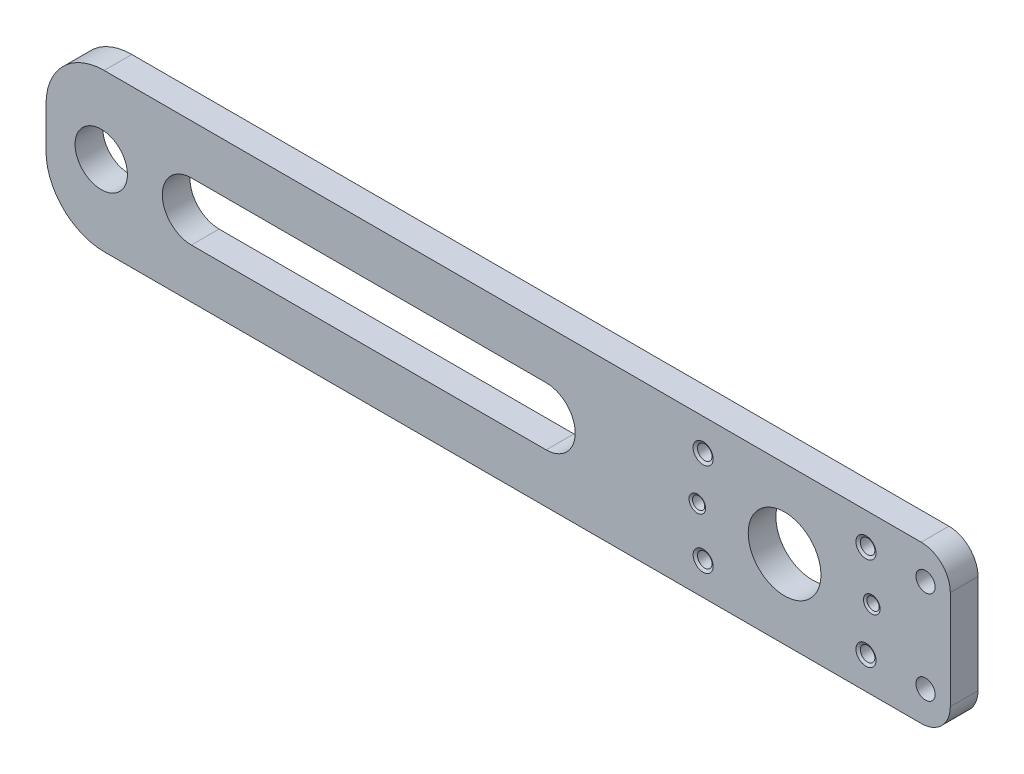
ISO-10303-21;
HEADER;
FILE_DESCRIPTION(('STEP AP214'),'2;1');
FILE_NAME('part.step','',(''),(''),'','','');
FILE_SCHEMA(('AUTOMOTIVE_DESIGN { 1 0 10303 214 1 1 1 1 }'));
ENDSEC;
DATA;
#1=APPLICATION_CONTEXT('core data for automotive mechanical design processes');
#2=APPLICATION_PROTOCOL_DEFINITION('international standard','automotive_design',2000,#1);
#3=PRODUCT_CONTEXT('',#1,'mechanical');
#4=PRODUCT('Part','Part','',(#3));
#5=PRODUCT_RELATED_PRODUCT_CATEGORY('part','',(#4));
#6=PRODUCT_DEFINITION_FORMATION('','',#4);
#7=PRODUCT_DEFINITION_CONTEXT('part definition',#1,'design');
#8=PRODUCT_DEFINITION('design','',#6,#7);
#9=PRODUCT_DEFINITION_SHAPE('','',#8);
#10=(LENGTH_UNIT() NAMED_UNIT(*) SI_UNIT(.MILLI.,.METRE.));
#11=(NAMED_UNIT(*) PLANE_ANGLE_UNIT() SI_UNIT($,.RADIAN.));
#12=(NAMED_UNIT(*) SI_UNIT($,.STERADIAN.) SOLID_ANGLE_UNIT());
#13=UNCERTAINTY_MEASURE_WITH_UNIT(LENGTH_MEASURE(1.E-05),#10,'distance_accuracy_value','');
#14=(GEOMETRIC_REPRESENTATION_CONTEXT(3) GLOBAL_UNCERTAINTY_ASSIGNED_CONTEXT((#13)) GLOBAL_UNIT_ASSIGNED_CONTEXT((#10,
#11,#12)) REPRESENTATION_CONTEXT('',''));
#15=CARTESIAN_POINT('',(0.,0.,0.));
#16=DIRECTION('',(0.,0.,1.));
#17=DIRECTION('',(1.,0.,0.));
#18=AXIS2_PLACEMENT_3D('',#15,#16,#17);
#19=CARTESIAN_POINT('',(504.510652388512,-385.151572168843,-676.825000000008));
#20=DIRECTION('',(0.,0.,1.));
#21=DIRECTION('',(1.,0.,0.));
#22=AXIS2_PLACEMENT_3D('',#19,#20,#21);
#23=CONICAL_SURFACE('',#22,3.45000000000895,1.0471975512156);
#24=CARTESIAN_POINT('',(504.510652388512,-385.151572168843,-676.825000000021));
#25=DIRECTION('',(0.,0.,1.));
#26=DIRECTION('',(1.,0.,0.));
#27=AXIS2_PLACEMENT_3D('',#24,#25,#26);
#28=CIRCLE('',#27,3.44999999998663);
#29=CARTESIAN_POINT('',(507.960652388499,-385.151572168843,-676.825000000021));
#30=VERTEX_POINT('',#29);
#31=EDGE_CURVE('E249',#30,#30,#28,.T.);
#32=ORIENTED_EDGE('',*,*,#31,.T.);
#33=EDGE_LOOP('',(#32));
#34=FACE_BOUND('',#33,.T.);
#35=CARTESIAN_POINT('',(504.510652388512,-385.151572168843,-677.37348275573));
#36=DIRECTION('',(0.,0.,1.));
#37=DIRECTION('',(1.,0.,0.));
#38=AXIS2_PLACEMENT_3D('',#35,#36,#37);
#39=CIRCLE('',#38,2.5);
#40=CARTESIAN_POINT('',(507.010652388512,-385.151572168843,-677.37348275573));
#41=VERTEX_POINT('',#40);
#42=EDGE_CURVE('E167',#41,#41,#39,.F.);
#43=ORIENTED_EDGE('',*,*,#42,.T.);
#44=EDGE_LOOP('',(#43));
#45=FACE_BOUND('',#44,.T.);
#46=ADVANCED_FACE('F17',(#34,#45),#23,.F.);
#47=CARTESIAN_POINT('',(504.510652388512,-417.151572168843,-676.825000000008));
#48=DIRECTION('',(0.,0.,1.));
#49=DIRECTION('',(1.,0.,0.));
#50=AXIS2_PLACEMENT_3D('',#47,#48,#49);
#51=CONICAL_SURFACE('',#50,3.45000000000895,1.0471975512156);
#52=CARTESIAN_POINT('',(504.510652388512,-417.151572168843,-676.825000000021));
#53=DIRECTION('',(0.,0.,1.));
#54=DIRECTION('',(1.,0.,0.));
#55=AXIS2_PLACEMENT_3D('',#52,#53,#54);
#56=CIRCLE('',#55,3.44999999998663);
#57=CARTESIAN_POINT('',(507.960652388499,-417.151572168843,-676.825000000021));
#58=VERTEX_POINT('',#57);
#59=EDGE_CURVE('E244',#58,#58,#56,.T.);
#60=ORIENTED_EDGE('',*,*,#59,.T.);
#61=EDGE_LOOP('',(#60));
#62=FACE_BOUND('',#61,.T.);
#63=CARTESIAN_POINT('',(504.510652388512,-417.151572168843,-677.37348275573));
#64=DIRECTION('',(0.,0.,1.));
#65=DIRECTION('',(1.,0.,0.));
#66=AXIS2_PLACEMENT_3D('',#63,#64,#65);
#67=CIRCLE('',#66,2.5);
#68=CARTESIAN_POINT('',(507.010652388512,-417.151572168843,-677.37348275573));
#69=VERTEX_POINT('',#68);
#70=EDGE_CURVE('E114',#69,#69,#67,.F.);
#71=ORIENTED_EDGE('',*,*,#70,.T.);
#72=EDGE_LOOP('',(#71));
#73=FACE_BOUND('',#72,.T.);
#74=ADVANCED_FACE('F559',(#62,#73),#51,.F.);
#75=CARTESIAN_POINT('',(446.510652388512,-401.151572168843,-676.825000000065));
#76=DIRECTION('',(0.,0.,1.));
#77=DIRECTION('',(1.,0.,0.));
#78=AXIS2_PLACEMENT_3D('',#75,#76,#77);
#79=CONICAL_SURFACE('',#78,2.86000000001341,1.04719755119142);
#80=CARTESIAN_POINT('',(446.510652388512,-401.151572168843,-676.825000000074));
#81=DIRECTION('',(0.,0.,1.));
#82=DIRECTION('',(1.,0.,0.));
#83=AXIS2_PLACEMENT_3D('',#80,#81,#82);
#84=CIRCLE('',#83,2.85999999999831);
#85=CARTESIAN_POINT('',(449.37065238851,-401.151572168843,-676.825000000074));
#86=VERTEX_POINT('',#85);
#87=EDGE_CURVE('E241',#86,#86,#84,.T.);
#88=ORIENTED_EDGE('',*,*,#87,.T.);
#89=EDGE_LOOP('',(#88));
#90=FACE_BOUND('',#89,.T.);
#91=CARTESIAN_POINT('',(446.510652388512,-401.151572168843,-677.263786204584));
#92=DIRECTION('',(0.,0.,1.));
#93=DIRECTION('',(1.,0.,0.));
#94=AXIS2_PLACEMENT_3D('',#91,#92,#93);
#95=CIRCLE('',#94,2.1);
#96=CARTESIAN_POINT('',(448.610652388512,-401.151572168843,-677.263786204584));
#97=VERTEX_POINT('',#96);
#98=EDGE_CURVE('E159',#97,#97,#95,.F.);
#99=ORIENTED_EDGE('',*,*,#98,.T.);
#100=EDGE_LOOP('',(#99));
#101=FACE_BOUND('',#100,.T.);
#102=ADVANCED_FACE('F551',(#90,#101),#79,.F.);
#103=CARTESIAN_POINT('',(448.510652388512,-417.151572168843,-676.825000000065));
#104=DIRECTION('',(0.,0.,1.));
#105=DIRECTION('',(1.,0.,0.));
#106=AXIS2_PLACEMENT_3D('',#103,#104,#105);
#107=CONICAL_SURFACE('',#106,3.44999999999213,1.04719755119663);
#108=CARTESIAN_POINT('',(448.510652388512,-417.151572168843,-676.825000000068));
#109=DIRECTION('',(0.,0.,1.));
#110=DIRECTION('',(1.,0.,0.));
#111=AXIS2_PLACEMENT_3D('',#108,#109,#110);
#112=CIRCLE('',#111,3.44999999998663);
#113=CARTESIAN_POINT('',(451.960652388499,-417.151572168843,-676.825000000068));
#114=VERTEX_POINT('',#113);
#115=EDGE_CURVE('E20',#114,#114,#112,.T.);
#116=ORIENTED_EDGE('',*,*,#115,.T.);
#117=EDGE_LOOP('',(#116));
#118=FACE_BOUND('',#117,.T.);
#119=CARTESIAN_POINT('',(448.510652388512,-417.151572168843,-677.37348275573));
#120=DIRECTION('',(0.,0.,1.));
#121=DIRECTION('',(1.,0.,0.));
#122=AXIS2_PLACEMENT_3D('',#119,#120,#121);
#123=CIRCLE('',#122,2.5);
#124=CARTESIAN_POINT('',(451.010652388512,-417.151572168843,-677.37348275573));
#125=VERTEX_POINT('',#124);
#126=EDGE_CURVE('E156',#125,#125,#123,.F.);
#127=ORIENTED_EDGE('',*,*,#126,.T.);
#128=EDGE_LOOP('',(#127));
#129=FACE_BOUND('',#128,.T.);
#130=ADVANCED_FACE('F256',(#118,#129),#107,.F.);
#131=CARTESIAN_POINT('',(448.510652388512,-385.151572168843,-676.825000000065));
#132=DIRECTION('',(0.,0.,1.));
#133=DIRECTION('',(1.,0.,0.));
#134=AXIS2_PLACEMENT_3D('',#131,#132,#133);
#135=CONICAL_SURFACE('',#134,3.44999999999213,1.04719755119663);
#136=CARTESIAN_POINT('',(448.510652388512,-385.151572168843,-676.825000000068));
#137=DIRECTION('',(0.,0.,1.));
#138=DIRECTION('',(1.,0.,0.));
#139=AXIS2_PLACEMENT_3D('',#136,#137,#138);
#140=CIRCLE('',#139,3.44999999998663);
#141=CARTESIAN_POINT('',(451.960652388499,-385.151572168843,-676.825000000068));
#142=VERTEX_POINT('',#141);
#143=EDGE_CURVE('E247',#142,#142,#140,.T.);
#144=ORIENTED_EDGE('',*,*,#143,.T.);
#145=EDGE_LOOP('',(#144));
#146=FACE_BOUND('',#145,.T.);
#147=CARTESIAN_POINT('',(448.510652388512,-385.151572168843,-677.37348275573));
#148=DIRECTION('',(0.,0.,1.));
#149=DIRECTION('',(1.,0.,0.));
#150=AXIS2_PLACEMENT_3D('',#147,#148,#149);
#151=CIRCLE('',#150,2.5);
#152=CARTESIAN_POINT('',(451.010652388512,-385.151572168843,-677.37348275573));
#153=VERTEX_POINT('',#152);
#154=EDGE_CURVE('E153',#153,#153,#151,.F.);
#155=ORIENTED_EDGE('',*,*,#154,.T.);
#156=EDGE_LOOP('',(#155));
#157=FACE_BOUND('',#156,.T.);
#158=ADVANCED_FACE('F534',(#146,#157),#135,.F.);
#159=CARTESIAN_POINT('',(506.510652388512,-401.151572168843,-676.825000000065));
#160=DIRECTION('',(0.,0.,1.));
#161=DIRECTION('',(1.,0.,0.));
#162=AXIS2_PLACEMENT_3D('',#159,#160,#161);
#163=CONICAL_SURFACE('',#162,2.86000000001108,1.04719755119142);
#164=CARTESIAN_POINT('',(506.510652388512,-401.151572168843,-676.825000000072));
#165=DIRECTION('',(0.,0.,1.));
#166=DIRECTION('',(1.,0.,0.));
#167=AXIS2_PLACEMENT_3D('',#164,#165,#166);
#168=CIRCLE('',#167,2.85999999999831);
#169=CARTESIAN_POINT('',(509.37065238851,-401.151572168843,-676.825000000072));
#170=VERTEX_POINT('',#169);
#171=EDGE_CURVE('E238',#170,#170,#168,.T.);
#172=ORIENTED_EDGE('',*,*,#171,.T.);
#173=EDGE_LOOP('',(#172));
#174=FACE_BOUND('',#173,.T.);
#175=CARTESIAN_POINT('',(506.510652388512,-401.151572168843,-677.263786204584));
#176=DIRECTION('',(0.,0.,1.));
#177=DIRECTION('',(1.,0.,0.));
#178=AXIS2_PLACEMENT_3D('',#175,#176,#177);
#179=CIRCLE('',#178,2.1);
#180=CARTESIAN_POINT('',(508.610652388512,-401.151572168843,-677.263786204584));
#181=VERTEX_POINT('',#180);
#182=EDGE_CURVE('E149',#181,#181,#179,.F.);
#183=ORIENTED_EDGE('',*,*,#182,.T.);
#184=EDGE_LOOP('',(#183));
#185=FACE_BOUND('',#184,.T.);
#186=ADVANCED_FACE('F262',(#174,#185),#163,.F.);
#187=CARTESIAN_POINT('',(476.510652388512,-354.095322168843,-676.825));
#188=DIRECTION('',(0.,0.,-1.));
#189=DIRECTION('',(-1.,0.,0.));
#190=AXIS2_PLACEMENT_3D('',#187,#188,#189);
#191=PLANE('',#190);
#192=CARTESIAN_POINT('',(523.510652388512,-418.151572168843,-676.825));
#193=DIRECTION('',(0.,0.,-1.));
#194=DIRECTION('',(-1.,0.,0.));
#195=AXIS2_PLACEMENT_3D('',#192,#193,#194);
#196=CIRCLE('',#195,10.);
#197=CARTESIAN_POINT('',(533.510652388512,-418.151572168843,-676.825));
#198=VERTEX_POINT('',#197);
#199=CARTESIAN_POINT('',(523.510652388512,-428.151572168843,-676.825));
#200=VERTEX_POINT('',#199);
#201=EDGE_CURVE('E222',#198,#200,#196,.T.);
#202=ORIENTED_EDGE('',*,*,#201,.F.);
#203=DIRECTION('',(0.,1.,0.));
#204=VECTOR('',#203,1.);
#205=CARTESIAN_POINT('',(533.510652388512,-431.151572168843,-676.825));
#206=LINE('',#205,#204);
#207=CARTESIAN_POINT('',(533.510652388512,-384.151572168843,-676.825));
#208=VERTEX_POINT('',#207);
#209=EDGE_CURVE('E141',#208,#198,#206,.F.);
#210=ORIENTED_EDGE('',*,*,#209,.F.);
#211=CARTESIAN_POINT('',(523.510652388512,-384.151572168843,-676.825));
#212=DIRECTION('',(0.,0.,-1.));
#213=DIRECTION('',(-1.,0.,0.));
#214=AXIS2_PLACEMENT_3D('',#211,#212,#213);
#215=CIRCLE('',#214,10.);
#216=CARTESIAN_POINT('',(523.510652388512,-374.151572168843,-676.825));
#217=VERTEX_POINT('',#216);
#218=EDGE_CURVE('E224',#217,#208,#215,.T.);
#219=ORIENTED_EDGE('',*,*,#218,.F.);
#220=DIRECTION('',(-1.,0.,0.));
#221=VECTOR('',#220,1.);
#222=CARTESIAN_POINT('',(503.956052731738,-374.151572168843,-676.825));
#223=LINE('',#222,#221);
#224=CARTESIAN_POINT('',(242.510652388512,-374.151572168843,-676.825));
#225=VERTEX_POINT('',#224);
#226=EDGE_CURVE('E145',#225,#217,#223,.F.);
#227=ORIENTED_EDGE('',*,*,#226,.F.);
#228=CARTESIAN_POINT('',(242.510652388512,-394.151572168843,-676.825));
#229=DIRECTION('',(0.,0.,1.));
#230=DIRECTION('',(1.,0.,0.));
#231=AXIS2_PLACEMENT_3D('',#228,#229,#230);
#232=CIRCLE('',#231,20.);
#233=CARTESIAN_POINT('',(222.510652388512,-394.151572168843,-676.825));
#234=VERTEX_POINT('',#233);
#235=EDGE_CURVE('E226',#234,#225,#232,.F.);
#236=ORIENTED_EDGE('',*,*,#235,.F.);
#237=DIRECTION('',(0.,1.,0.));
#238=VECTOR('',#237,1.);
#239=CARTESIAN_POINT('',(222.510652388512,-371.151572168843,-676.825));
#240=LINE('',#239,#238);
#241=CARTESIAN_POINT('',(222.510652388512,-408.151572168843,-676.825));
#242=VERTEX_POINT('',#241);
#243=EDGE_CURVE('E137',#234,#242,#240,.F.);
#244=ORIENTED_EDGE('',*,*,#243,.T.);
#245=CARTESIAN_POINT('',(242.510652388512,-408.151572168843,-676.825));
#246=DIRECTION('',(0.,0.,-1.));
#247=DIRECTION('',(-1.,0.,0.));
#248=AXIS2_PLACEMENT_3D('',#245,#246,#247);
#249=CIRCLE('',#248,20.);
#250=CARTESIAN_POINT('',(242.510652388512,-428.151572168843,-676.825));
#251=VERTEX_POINT('',#250);
#252=EDGE_CURVE('E219',#251,#242,#249,.T.);
#253=ORIENTED_EDGE('',*,*,#252,.F.);
#254=DIRECTION('',(1.,0.,0.));
#255=VECTOR('',#254,1.);
#256=CARTESIAN_POINT('',(449.065252045285,-428.151572168843,-676.825));
#257=LINE('',#256,#255);
#258=EDGE_CURVE('E133',#200,#251,#257,.F.);
#259=ORIENTED_EDGE('',*,*,#258,.F.);
#260=EDGE_LOOP('',(#202,#210,#219,#227,#236,#244,#253,#259));
#261=FACE_BOUND('',#260,.T.);
#262=CARTESIAN_POINT('',(524.985652388511,-417.151572168843,-676.825));
#263=DIRECTION('',(0.,0.,-1.));
#264=DIRECTION('',(-1.,0.,0.));
#265=AXIS2_PLACEMENT_3D('',#262,#263,#264);
#266=CIRCLE('',#265,3.3);
#267=CARTESIAN_POINT('',(521.685652388511,-417.151572168843,-676.825));
#268=VERTEX_POINT('',#267);
#269=EDGE_CURVE('E140',#268,#268,#266,.T.);
#270=ORIENTED_EDGE('',*,*,#269,.T.);
#271=EDGE_LOOP('',(#270));
#272=FACE_BOUND('',#271,.T.);
#273=ORIENTED_EDGE('',*,*,#171,.F.);
#274=EDGE_LOOP('',(#273));
#275=FACE_BOUND('',#274,.T.);
#276=CARTESIAN_POINT('',(476.510652388512,-401.151572168843,-676.825));
#277=DIRECTION('',(0.,0.,-1.));
#278=DIRECTION('',(-1.,0.,0.));
#279=AXIS2_PLACEMENT_3D('',#276,#277,#278);
#280=CIRCLE('',#279,12.5);
#281=CARTESIAN_POINT('',(464.010652388512,-401.151572168843,-676.825));
#282=VERTEX_POINT('',#281);
#283=EDGE_CURVE('E152',#282,#282,#280,.T.);
#284=ORIENTED_EDGE('',*,*,#283,.T.);
#285=EDGE_LOOP('',(#284));
#286=FACE_BOUND('',#285,.T.);
#287=ORIENTED_EDGE('',*,*,#87,.F.);
#288=EDGE_LOOP('',(#287));
#289=FACE_BOUND('',#288,.T.);
#290=ORIENTED_EDGE('',*,*,#59,.F.);
#291=EDGE_LOOP('',(#290));
#292=FACE_BOUND('',#291,.T.);
#293=ORIENTED_EDGE('',*,*,#143,.F.);
#294=EDGE_LOOP('',(#293));
#295=FACE_BOUND('',#294,.T.);
#296=DIRECTION('',(1.,0.,0.));
#297=VECTOR('',#296,1.);
#298=CARTESIAN_POINT('',(272.510652388512,-411.151572168843,-676.825));
#299=LINE('',#298,#297);
#300=CARTESIAN_POINT('',(394.510652388512,-411.151572168843,-676.825));
#301=VERTEX_POINT('',#300);
#302=CARTESIAN_POINT('',(272.510652388512,-411.151572168843,-676.825));
#303=VERTEX_POINT('',#302);
#304=EDGE_CURVE('E117',#301,#303,#299,.F.);
#305=ORIENTED_EDGE('',*,*,#304,.T.);
#306=CARTESIAN_POINT('',(272.510652388512,-401.151572168843,-676.825));
#307=DIRECTION('',(0.,0.,-1.));
#308=DIRECTION('',(-1.,0.,0.));
#309=AXIS2_PLACEMENT_3D('',#306,#307,#308);
#310=CIRCLE('',#309,10.);
#311=CARTESIAN_POINT('',(272.510652388512,-391.151572168843,-676.825));
#312=VERTEX_POINT('',#311);
#313=EDGE_CURVE('E103',#303,#312,#310,.T.);
#314=ORIENTED_EDGE('',*,*,#313,.T.);
#315=DIRECTION('',(1.,0.,0.));
#316=VECTOR('',#315,1.);
#317=CARTESIAN_POINT('',(382.510652388512,-391.151572168843,-676.825));
#318=LINE('',#317,#316);
#319=CARTESIAN_POINT('',(394.510652388512,-391.151572168843,-676.825));
#320=VERTEX_POINT('',#319);
#321=EDGE_CURVE('E162',#312,#320,#318,.T.);
#322=ORIENTED_EDGE('',*,*,#321,.T.);
#323=CARTESIAN_POINT('',(394.510652388512,-401.151572168843,-676.825));
#324=DIRECTION('',(0.,0.,-1.));
#325=DIRECTION('',(-1.,0.,0.));
#326=AXIS2_PLACEMENT_3D('',#323,#324,#325);
#327=CIRCLE('',#326,10.);
#328=EDGE_CURVE('E120',#320,#301,#327,.T.);
#329=ORIENTED_EDGE('',*,*,#328,.T.);
#330=EDGE_LOOP('',(#305,#314,#322,#329));
#331=FACE_BOUND('',#330,.T.);
#332=ORIENTED_EDGE('',*,*,#31,.F.);
#333=EDGE_LOOP('',(#332));
#334=FACE_BOUND('',#333,.T.);
#335=CARTESIAN_POINT('',(241.510652388512,-401.151572168843,-676.825));
#336=DIRECTION('',(0.,0.,-1.));
#337=DIRECTION('',(-1.,0.,0.));
#338=AXIS2_PLACEMENT_3D('',#335,#336,#337);
#339=CIRCLE('',#338,9.);
#340=CARTESIAN_POINT('',(232.510652388512,-401.151572168843,-676.825));
#341=VERTEX_POINT('',#340);
#342=EDGE_CURVE('E166',#341,#341,#339,.T.);
#343=ORIENTED_EDGE('',*,*,#342,.T.);
#344=EDGE_LOOP('',(#343));
#345=FACE_BOUND('',#344,.T.);
#346=ORIENTED_EDGE('',*,*,#115,.F.);
#347=EDGE_LOOP('',(#346));
#348=FACE_BOUND('',#347,.T.);
#349=CARTESIAN_POINT('',(524.985652388511,-385.151572168843,-676.825));
#350=DIRECTION('',(0.,0.,-1.));
#351=DIRECTION('',(-1.,0.,0.));
#352=AXIS2_PLACEMENT_3D('',#349,#350,#351);
#353=CIRCLE('',#352,3.3);
#354=CARTESIAN_POINT('',(521.685652388511,-385.151572168843,-676.825));
#355=VERTEX_POINT('',#354);
#356=EDGE_CURVE('E169',#355,#355,#353,.T.);
#357=ORIENTED_EDGE('',*,*,#356,.T.);
#358=EDGE_LOOP('',(#357));
#359=FACE_BOUND('',#358,.T.);
#360=ADVANCED_FACE('F118',(#261,#272,#275,#286,#289,#292,#295,#331,#334,#345,#348,#359),#191,.F.);
#361=CARTESIAN_POINT('',(524.985652388511,-385.151572168843,-675.8724976));
#362=DIRECTION('',(0.,0.,-1.));
#363=DIRECTION('',(-1.,0.,0.));
#364=AXIS2_PLACEMENT_3D('',#361,#362,#363);
#365=CYLINDRICAL_SURFACE('',#364,3.3);
#366=CARTESIAN_POINT('',(524.985652388511,-385.151572168843,-686.35));
#367=DIRECTION('',(0.,0.,-1.));
#368=DIRECTION('',(-1.,0.,0.));
#369=AXIS2_PLACEMENT_3D('',#366,#367,#368);
#370=CIRCLE('',#369,3.3);
#371=CARTESIAN_POINT('',(521.685652388511,-385.151572168843,-686.35));
#372=VERTEX_POINT('',#371);
#373=EDGE_CURVE('E216',#372,#372,#370,.F.);
#374=ORIENTED_EDGE('',*,*,#373,.F.);
#375=EDGE_LOOP('',(#374));
#376=FACE_BOUND('',#375,.T.);
#377=ORIENTED_EDGE('',*,*,#356,.F.);
#378=EDGE_LOOP('',(#377));
#379=FACE_BOUND('',#378,.T.);
#380=ADVANCED_FACE('F261',(#376,#379),#365,.F.);
#381=CARTESIAN_POINT('',(504.510652388512,-385.151572168843,-676.825));
#382=DIRECTION('',(0.,0.,1.));
#383=DIRECTION('',(1.,0.,0.));
#384=AXIS2_PLACEMENT_3D('',#381,#382,#383);
#385=CYLINDRICAL_SURFACE('',#384,2.5);
#386=ORIENTED_EDGE('',*,*,#42,.F.);
#387=EDGE_LOOP('',(#386));
#388=FACE_BOUND('',#387,.T.);
#389=CARTESIAN_POINT('',(504.510652388512,-385.151572168843,-686.35));
#390=DIRECTION('',(0.,0.,1.));
#391=DIRECTION('',(1.,0.,0.));
#392=AXIS2_PLACEMENT_3D('',#389,#390,#391);
#393=CIRCLE('',#392,2.5);
#394=CARTESIAN_POINT('',(507.010652388512,-385.151572168843,-686.35));
#395=VERTEX_POINT('',#394);
#396=EDGE_CURVE('E213',#395,#395,#393,.T.);
#397=ORIENTED_EDGE('',*,*,#396,.F.);
#398=EDGE_LOOP('',(#397));
#399=FACE_BOUND('',#398,.T.);
#400=ADVANCED_FACE('F268',(#388,#399),#385,.F.);
#401=CARTESIAN_POINT('',(241.510652388512,-401.151572168843,-675.8724976));
#402=DIRECTION('',(0.,0.,-1.));
#403=DIRECTION('',(-1.,0.,0.));
#404=AXIS2_PLACEMENT_3D('',#401,#402,#403);
#405=CYLINDRICAL_SURFACE('',#404,9.);
#406=CARTESIAN_POINT('',(241.510652388512,-401.151572168843,-686.35));
#407=DIRECTION('',(0.,0.,-1.));
#408=DIRECTION('',(-1.,0.,0.));
#409=AXIS2_PLACEMENT_3D('',#406,#407,#408);
#410=CIRCLE('',#409,9.);
#411=CARTESIAN_POINT('',(232.510652388512,-401.151572168843,-686.35));
#412=VERTEX_POINT('',#411);
#413=EDGE_CURVE('E210',#412,#412,#410,.F.);
#414=ORIENTED_EDGE('',*,*,#413,.F.);
#415=EDGE_LOOP('',(#414));
#416=FACE_BOUND('',#415,.T.);
#417=ORIENTED_EDGE('',*,*,#342,.F.);
#418=EDGE_LOOP('',(#417));
#419=FACE_BOUND('',#418,.T.);
#420=ADVANCED_FACE('F275',(#416,#419),#405,.F.);
#421=CARTESIAN_POINT('',(504.510652388512,-417.151572168843,-676.825));
#422=DIRECTION('',(0.,0.,1.));
#423=DIRECTION('',(1.,0.,0.));
#424=AXIS2_PLACEMENT_3D('',#421,#422,#423);
#425=CYLINDRICAL_SURFACE('',#424,2.5);
#426=ORIENTED_EDGE('',*,*,#70,.F.);
#427=EDGE_LOOP('',(#426));
#428=FACE_BOUND('',#427,.T.);
#429=CARTESIAN_POINT('',(504.510652388512,-417.151572168843,-686.35));
#430=DIRECTION('',(0.,0.,1.));
#431=DIRECTION('',(1.,0.,0.));
#432=AXIS2_PLACEMENT_3D('',#429,#430,#431);
#433=CIRCLE('',#432,2.5);
#434=CARTESIAN_POINT('',(507.010652388512,-417.151572168843,-686.35));
#435=VERTEX_POINT('',#434);
#436=EDGE_CURVE('E207',#435,#435,#433,.T.);
#437=ORIENTED_EDGE('',*,*,#436,.F.);
#438=EDGE_LOOP('',(#437));
#439=FACE_BOUND('',#438,.T.);
#440=ADVANCED_FACE('F355',(#428,#439),#425,.F.);
#441=CARTESIAN_POINT('',(272.510652388512,-401.151572168843,-675.8724976));
#442=DIRECTION('',(0.,0.,-1.));
#443=DIRECTION('',(-1.,0.,0.));
#444=AXIS2_PLACEMENT_3D('',#441,#442,#443);
#445=CYLINDRICAL_SURFACE('',#444,10.);
#446=DIRECTION('',(0.,0.,-1.));
#447=VECTOR('',#446,1.);
#448=CARTESIAN_POINT('',(272.510652388512,-411.151572168843,-675.8724976));
#449=LINE('',#448,#447);
#450=CARTESIAN_POINT('',(272.510652388512,-411.151572168843,-686.35));
#451=VERTEX_POINT('',#450);
#452=EDGE_CURVE('E107',#303,#451,#449,.T.);
#453=ORIENTED_EDGE('',*,*,#452,.T.);
#454=CARTESIAN_POINT('',(272.510652388512,-401.151572168843,-686.35));
#455=DIRECTION('',(0.,0.,-1.));
#456=DIRECTION('',(-1.,0.,0.));
#457=AXIS2_PLACEMENT_3D('',#454,#455,#456);
#458=CIRCLE('',#457,10.);
#459=CARTESIAN_POINT('',(272.510652388512,-391.151572168843,-686.35));
#460=VERTEX_POINT('',#459);
#461=EDGE_CURVE('E205',#460,#451,#458,.F.);
#462=ORIENTED_EDGE('',*,*,#461,.F.);
#463=DIRECTION('',(0.,0.,1.));
#464=VECTOR('',#463,1.);
#465=CARTESIAN_POINT('',(272.510652388512,-391.151572168843,-675.8724976));
#466=LINE('',#465,#464);
#467=EDGE_CURVE('E110',#460,#312,#466,.T.);
#468=ORIENTED_EDGE('',*,*,#467,.T.);
#469=ORIENTED_EDGE('',*,*,#313,.F.);
#470=EDGE_LOOP('',(#453,#462,#468,#469));
#471=FACE_BOUND('',#470,.T.);
#472=ADVANCED_FACE('F105',(#471),#445,.F.);
#473=CARTESIAN_POINT('',(272.510652388512,-411.151572168843,-675.8724976));
#474=DIRECTION('',(0.,-1.,0.));
#475=DIRECTION('',(0.,0.,-1.));
#476=AXIS2_PLACEMENT_3D('',#473,#474,#475);
#477=PLANE('',#476);
#478=DIRECTION('',(0.,0.,-1.));
#479=VECTOR('',#478,1.);
#480=CARTESIAN_POINT('',(394.510652388512,-411.151572168843,-675.8724976));
#481=LINE('',#480,#479);
#482=CARTESIAN_POINT('',(394.510652388512,-411.151572168843,-686.35));
#483=VERTEX_POINT('',#482);
#484=EDGE_CURVE('E123',#301,#483,#481,.T.);
#485=ORIENTED_EDGE('',*,*,#484,.T.);
#486=DIRECTION('',(-1.,0.,0.));
#487=VECTOR('',#486,1.);
#488=CARTESIAN_POINT('',(476.510652388512,-411.151572168843,-686.35));
#489=LINE('',#488,#487);
#490=EDGE_CURVE('E127',#451,#483,#489,.F.);
#491=ORIENTED_EDGE('',*,*,#490,.F.);
#492=ORIENTED_EDGE('',*,*,#452,.F.);
#493=ORIENTED_EDGE('',*,*,#304,.F.);
#494=EDGE_LOOP('',(#485,#491,#492,#493));
#495=FACE_BOUND('',#494,.T.);
#496=ADVANCED_FACE('F125',(#495),#477,.F.);
#497=CARTESIAN_POINT('',(394.510652388512,-401.151572168843,-675.8724976));
#498=DIRECTION('',(0.,0.,-1.));
#499=DIRECTION('',(-1.,0.,0.));
#500=AXIS2_PLACEMENT_3D('',#497,#498,#499);
#501=CYLINDRICAL_SURFACE('',#500,10.);
#502=DIRECTION('',(0.,0.,1.));
#503=VECTOR('',#502,1.);
#504=CARTESIAN_POINT('',(394.510652388512,-391.151572168843,-675.8724976));
#505=LINE('',#504,#503);
#506=CARTESIAN_POINT('',(394.510652388512,-391.151572168843,-686.35));
#507=VERTEX_POINT('',#506);
#508=EDGE_CURVE('E232',#320,#507,#505,.F.);
#509=ORIENTED_EDGE('',*,*,#508,.T.);
#510=CARTESIAN_POINT('',(394.510652388512,-401.151572168843,-686.35));
#511=DIRECTION('',(0.,0.,-1.));
#512=DIRECTION('',(-1.,0.,0.));
#513=AXIS2_PLACEMENT_3D('',#510,#511,#512);
#514=CIRCLE('',#513,10.);
#515=EDGE_CURVE('E202',#483,#507,#514,.F.);
#516=ORIENTED_EDGE('',*,*,#515,.F.);
#517=ORIENTED_EDGE('',*,*,#484,.F.);
#518=ORIENTED_EDGE('',*,*,#328,.F.);
#519=EDGE_LOOP('',(#509,#516,#517,#518));
#520=FACE_BOUND('',#519,.T.);
#521=ADVANCED_FACE('F346',(#520),#501,.F.);
#522=CARTESIAN_POINT('',(382.510652388512,-391.151572168843,-675.8724976));
#523=DIRECTION('',(0.,1.,0.));
#524=DIRECTION('',(0.,0.,1.));
#525=AXIS2_PLACEMENT_3D('',#522,#523,#524);
#526=PLANE('',#525);
#527=ORIENTED_EDGE('',*,*,#467,.F.);
#528=DIRECTION('',(-1.,0.,0.));
#529=VECTOR('',#528,1.);
#530=CARTESIAN_POINT('',(476.510652388512,-391.151572168843,-686.35));
#531=LINE('',#530,#529);
#532=EDGE_CURVE('E201',#507,#460,#531,.T.);
#533=ORIENTED_EDGE('',*,*,#532,.F.);
#534=ORIENTED_EDGE('',*,*,#508,.F.);
#535=ORIENTED_EDGE('',*,*,#321,.F.);
#536=EDGE_LOOP('',(#527,#533,#534,#535));
#537=FACE_BOUND('',#536,.T.);
#538=ADVANCED_FACE('F342',(#537),#526,.F.);
#539=CARTESIAN_POINT('',(446.510652388512,-401.151572168843,-676.825));
#540=DIRECTION('',(0.,0.,1.));
#541=DIRECTION('',(1.,0.,0.));
#542=AXIS2_PLACEMENT_3D('',#539,#540,#541);
#543=CYLINDRICAL_SURFACE('',#542,2.1);
#544=ORIENTED_EDGE('',*,*,#98,.F.);
#545=EDGE_LOOP('',(#544));
#546=FACE_BOUND('',#545,.T.);
#547=CARTESIAN_POINT('',(446.510652388512,-401.151572168843,-686.35));
#548=DIRECTION('',(0.,0.,1.));
#549=DIRECTION('',(1.,0.,0.));
#550=AXIS2_PLACEMENT_3D('',#547,#548,#549);
#551=CIRCLE('',#550,2.1);
#552=CARTESIAN_POINT('',(448.610652388512,-401.151572168843,-686.35));
#553=VERTEX_POINT('',#552);
#554=EDGE_CURVE('E198',#553,#553,#551,.T.);
#555=ORIENTED_EDGE('',*,*,#554,.F.);
#556=EDGE_LOOP('',(#555));
#557=FACE_BOUND('',#556,.T.);
#558=ADVANCED_FACE('F338',(#546,#557),#543,.F.);
#559=CARTESIAN_POINT('',(448.510652388512,-417.151572168843,-676.825));
#560=DIRECTION('',(0.,0.,1.));
#561=DIRECTION('',(1.,0.,0.));
#562=AXIS2_PLACEMENT_3D('',#559,#560,#561);
#563=CYLINDRICAL_SURFACE('',#562,2.5);
#564=ORIENTED_EDGE('',*,*,#126,.F.);
#565=EDGE_LOOP('',(#564));
#566=FACE_BOUND('',#565,.T.);
#567=CARTESIAN_POINT('',(448.510652388512,-417.151572168843,-686.35));
#568=DIRECTION('',(0.,0.,1.));
#569=DIRECTION('',(1.,0.,0.));
#570=AXIS2_PLACEMENT_3D('',#567,#568,#569);
#571=CIRCLE('',#570,2.5);
#572=CARTESIAN_POINT('',(451.010652388512,-417.151572168843,-686.35));
#573=VERTEX_POINT('',#572);
#574=EDGE_CURVE('E195',#573,#573,#571,.T.);
#575=ORIENTED_EDGE('',*,*,#574,.F.);
#576=EDGE_LOOP('',(#575));
#577=FACE_BOUND('',#576,.T.);
#578=ADVANCED_FACE('F334',(#566,#577),#563,.F.);
#579=CARTESIAN_POINT('',(448.510652388512,-385.151572168843,-676.825));
#580=DIRECTION('',(0.,0.,1.));
#581=DIRECTION('',(1.,0.,0.));
#582=AXIS2_PLACEMENT_3D('',#579,#580,#581);
#583=CYLINDRICAL_SURFACE('',#582,2.5);
#584=ORIENTED_EDGE('',*,*,#154,.F.);
#585=EDGE_LOOP('',(#584));
#586=FACE_BOUND('',#585,.T.);
#587=CARTESIAN_POINT('',(448.510652388512,-385.151572168843,-686.35));
#588=DIRECTION('',(0.,0.,1.));
#589=DIRECTION('',(1.,0.,0.));
#590=AXIS2_PLACEMENT_3D('',#587,#588,#589);
#591=CIRCLE('',#590,2.5);
#592=CARTESIAN_POINT('',(451.010652388512,-385.151572168843,-686.35));
#593=VERTEX_POINT('',#592);
#594=EDGE_CURVE('E192',#593,#593,#591,.T.);
#595=ORIENTED_EDGE('',*,*,#594,.F.);
#596=EDGE_LOOP('',(#595));
#597=FACE_BOUND('',#596,.T.);
#598=ADVANCED_FACE('F330',(#586,#597),#583,.F.);
#599=CARTESIAN_POINT('',(506.510652388512,-401.151572168843,-676.825));
#600=DIRECTION('',(0.,0.,1.));
#601=DIRECTION('',(1.,0.,0.));
#602=AXIS2_PLACEMENT_3D('',#599,#600,#601);
#603=CYLINDRICAL_SURFACE('',#602,2.1);
#604=ORIENTED_EDGE('',*,*,#182,.F.);
#605=EDGE_LOOP('',(#604));
#606=FACE_BOUND('',#605,.T.);
#607=CARTESIAN_POINT('',(506.510652388512,-401.151572168843,-686.35));
#608=DIRECTION('',(0.,0.,1.));
#609=DIRECTION('',(1.,0.,0.));
#610=AXIS2_PLACEMENT_3D('',#607,#608,#609);
#611=CIRCLE('',#610,2.1);
#612=CARTESIAN_POINT('',(508.610652388512,-401.151572168843,-686.35));
#613=VERTEX_POINT('',#612);
#614=EDGE_CURVE('E189',#613,#613,#611,.T.);
#615=ORIENTED_EDGE('',*,*,#614,.F.);
#616=EDGE_LOOP('',(#615));
#617=FACE_BOUND('',#616,.T.);
#618=ADVANCED_FACE('F326',(#606,#617),#603,.F.);
#619=CARTESIAN_POINT('',(476.510652388512,-401.151572168843,-686.35));
#620=DIRECTION('',(0.,0.,-1.));
#621=DIRECTION('',(-1.,0.,0.));
#622=AXIS2_PLACEMENT_3D('',#619,#620,#621);
#623=CYLINDRICAL_SURFACE('',#622,12.5);
#624=CARTESIAN_POINT('',(476.510652388512,-401.151572168843,-686.35));
#625=DIRECTION('',(0.,0.,-1.));
#626=DIRECTION('',(-1.,0.,0.));
#627=AXIS2_PLACEMENT_3D('',#624,#625,#626);
#628=CIRCLE('',#627,12.5);
#629=CARTESIAN_POINT('',(464.010652388512,-401.151572168843,-686.35));
#630=VERTEX_POINT('',#629);
#631=EDGE_CURVE('E186',#630,#630,#628,.F.);
#632=ORIENTED_EDGE('',*,*,#631,.F.);
#633=EDGE_LOOP('',(#632));
#634=FACE_BOUND('',#633,.T.);
#635=ORIENTED_EDGE('',*,*,#283,.F.);
#636=EDGE_LOOP('',(#635));
#637=FACE_BOUND('',#636,.T.);
#638=ADVANCED_FACE('F322',(#634,#637),#623,.F.);
#639=CARTESIAN_POINT('',(524.985652388511,-417.151572168843,-675.8724976));
#640=DIRECTION('',(0.,0.,-1.));
#641=DIRECTION('',(-1.,0.,0.));
#642=AXIS2_PLACEMENT_3D('',#639,#640,#641);
#643=CYLINDRICAL_SURFACE('',#642,3.3);
#644=CARTESIAN_POINT('',(524.985652388511,-417.151572168843,-686.35));
#645=DIRECTION('',(0.,0.,-1.));
#646=DIRECTION('',(-1.,0.,0.));
#647=AXIS2_PLACEMENT_3D('',#644,#645,#646);
#648=CIRCLE('',#647,3.3);
#649=CARTESIAN_POINT('',(521.685652388511,-417.151572168843,-686.35));
#650=VERTEX_POINT('',#649);
#651=EDGE_CURVE('E183',#650,#650,#648,.F.);
#652=ORIENTED_EDGE('',*,*,#651,.F.);
#653=EDGE_LOOP('',(#652));
#654=FACE_BOUND('',#653,.T.);
#655=ORIENTED_EDGE('',*,*,#269,.F.);
#656=EDGE_LOOP('',(#655));
#657=FACE_BOUND('',#656,.T.);
#658=ADVANCED_FACE('F318',(#654,#657),#643,.F.);
#659=CARTESIAN_POINT('',(222.510652388512,-371.151572168843,-686.35));
#660=DIRECTION('',(1.,0.,0.));
#661=DIRECTION('',(0.,0.,-1.));
#662=AXIS2_PLACEMENT_3D('',#659,#660,#661);
#663=PLANE('',#662);
#664=ORIENTED_EDGE('',*,*,#243,.F.);
#665=DIRECTION('',(0.,0.,1.));
#666=VECTOR('',#665,1.);
#667=CARTESIAN_POINT('',(222.510652388512,-394.151572168843,-686.35));
#668=LINE('',#667,#666);
#669=CARTESIAN_POINT('',(222.510652388512,-394.151572168843,-686.35));
#670=VERTEX_POINT('',#669);
#671=EDGE_CURVE('E139',#670,#234,#668,.T.);
#672=ORIENTED_EDGE('',*,*,#671,.F.);
#673=DIRECTION('',(0.,1.,0.));
#674=VECTOR('',#673,1.);
#675=CARTESIAN_POINT('',(222.510652388512,-354.095322168843,-686.35));
#676=LINE('',#675,#674);
#677=CARTESIAN_POINT('',(222.510652388512,-408.151572168843,-686.35));
#678=VERTEX_POINT('',#677);
#679=EDGE_CURVE('E182',#678,#670,#676,.T.);
#680=ORIENTED_EDGE('',*,*,#679,.F.);
#681=DIRECTION('',(0.,0.,-1.));
#682=VECTOR('',#681,1.);
#683=CARTESIAN_POINT('',(222.510652388512,-408.151572168843,-686.35));
#684=LINE('',#683,#682);
#685=EDGE_CURVE('E135',#242,#678,#684,.T.);
#686=ORIENTED_EDGE('',*,*,#685,.F.);
#687=EDGE_LOOP('',(#664,#672,#680,#686));
#688=FACE_BOUND('',#687,.T.);
#689=ADVANCED_FACE('F314',(#688),#663,.F.);
#690=CARTESIAN_POINT('',(242.510652388512,-394.151572168843,-686.35));
#691=DIRECTION('',(0.,0.,1.));
#692=DIRECTION('',(1.,0.,0.));
#693=AXIS2_PLACEMENT_3D('',#690,#691,#692);
#694=CYLINDRICAL_SURFACE('',#693,20.);
#695=DIRECTION('',(0.,0.,1.));
#696=VECTOR('',#695,1.);
#697=CARTESIAN_POINT('',(242.510652388512,-374.151572168843,-686.35));
#698=LINE('',#697,#696);
#699=CARTESIAN_POINT('',(242.510652388512,-374.151572168843,-686.35));
#700=VERTEX_POINT('',#699);
#701=EDGE_CURVE('E148',#700,#225,#698,.T.);
#702=ORIENTED_EDGE('',*,*,#701,.F.);
#703=CARTESIAN_POINT('',(242.510652388512,-394.151572168843,-686.35));
#704=DIRECTION('',(0.,0.,1.));
#705=DIRECTION('',(1.,0.,0.));
#706=AXIS2_PLACEMENT_3D('',#703,#704,#705);
#707=CIRCLE('',#706,20.);
#708=EDGE_CURVE('E179',#670,#700,#707,.F.);
#709=ORIENTED_EDGE('',*,*,#708,.F.);
#710=ORIENTED_EDGE('',*,*,#671,.T.);
#711=ORIENTED_EDGE('',*,*,#235,.T.);
#712=EDGE_LOOP('',(#702,#709,#710,#711));
#713=FACE_BOUND('',#712,.T.);
#714=ADVANCED_FACE('F310',(#713),#694,.T.);
#715=CARTESIAN_POINT('',(503.956052731738,-374.151572168843,-686.35));
#716=DIRECTION('',(0.,1.,0.));
#717=DIRECTION('',(-1.,0.,0.));
#718=AXIS2_PLACEMENT_3D('',#715,#716,#717);
#719=PLANE('',#718);
#720=ORIENTED_EDGE('',*,*,#701,.T.);
#721=ORIENTED_EDGE('',*,*,#226,.T.);
#722=DIRECTION('',(0.,0.,-1.));
#723=VECTOR('',#722,1.);
#724=CARTESIAN_POINT('',(523.510652388512,-374.151572168843,-686.35));
#725=LINE('',#724,#723);
#726=CARTESIAN_POINT('',(523.510652388512,-374.151572168843,-686.35));
#727=VERTEX_POINT('',#726);
#728=EDGE_CURVE('E147',#727,#217,#725,.F.);
#729=ORIENTED_EDGE('',*,*,#728,.F.);
#730=DIRECTION('',(-1.,0.,0.));
#731=VECTOR('',#730,1.);
#732=CARTESIAN_POINT('',(476.510652388512,-374.151572168843,-686.35));
#733=LINE('',#732,#731);
#734=EDGE_CURVE('E178',#700,#727,#733,.F.);
#735=ORIENTED_EDGE('',*,*,#734,.F.);
#736=EDGE_LOOP('',(#720,#721,#729,#735));
#737=FACE_BOUND('',#736,.T.);
#738=ADVANCED_FACE('F306',(#737),#719,.T.);
#739=CARTESIAN_POINT('',(523.510652388512,-384.151572168843,-686.35));
#740=DIRECTION('',(0.,0.,-1.));
#741=DIRECTION('',(-1.,0.,0.));
#742=AXIS2_PLACEMENT_3D('',#739,#740,#741);
#743=CYLINDRICAL_SURFACE('',#742,10.);
#744=DIRECTION('',(0.,0.,-1.));
#745=VECTOR('',#744,1.);
#746=CARTESIAN_POINT('',(533.510652388512,-384.151572168843,-586.0875));
#747=LINE('',#746,#745);
#748=CARTESIAN_POINT('',(533.510652388512,-384.151572168843,-686.35));
#749=VERTEX_POINT('',#748);
#750=EDGE_CURVE('E144',#749,#208,#747,.F.);
#751=ORIENTED_EDGE('',*,*,#750,.F.);
#752=CARTESIAN_POINT('',(523.510652388512,-384.151572168843,-686.35));
#753=DIRECTION('',(0.,0.,-1.));
#754=DIRECTION('',(-1.,0.,0.));
#755=AXIS2_PLACEMENT_3D('',#752,#753,#754);
#756=CIRCLE('',#755,10.);
#757=EDGE_CURVE('E175',#727,#749,#756,.T.);
#758=ORIENTED_EDGE('',*,*,#757,.F.);
#759=ORIENTED_EDGE('',*,*,#728,.T.);
#760=ORIENTED_EDGE('',*,*,#218,.T.);
#761=EDGE_LOOP('',(#751,#758,#759,#760));
#762=FACE_BOUND('',#761,.T.);
#763=ADVANCED_FACE('F302',(#762),#743,.T.);
#764=CARTESIAN_POINT('',(533.510652388512,-431.151572168843,-586.0875));
#765=DIRECTION('',(1.,0.,0.));
#766=DIRECTION('',(0.,0.,-1.));
#767=AXIS2_PLACEMENT_3D('',#764,#765,#766);
#768=PLANE('',#767);
#769=ORIENTED_EDGE('',*,*,#750,.T.);
#770=ORIENTED_EDGE('',*,*,#209,.T.);
#771=DIRECTION('',(0.,0.,-1.));
#772=VECTOR('',#771,1.);
#773=CARTESIAN_POINT('',(533.510652388512,-418.151572168843,-686.35));
#774=LINE('',#773,#772);
#775=CARTESIAN_POINT('',(533.510652388512,-418.151572168843,-686.35));
#776=VERTEX_POINT('',#775);
#777=EDGE_CURVE('E143',#776,#198,#774,.F.);
#778=ORIENTED_EDGE('',*,*,#777,.F.);
#779=DIRECTION('',(0.,1.,0.));
#780=VECTOR('',#779,1.);
#781=CARTESIAN_POINT('',(533.510652388512,-354.095322168843,-686.35));
#782=LINE('',#781,#780);
#783=EDGE_CURVE('E174',#749,#776,#782,.F.);
#784=ORIENTED_EDGE('',*,*,#783,.F.);
#785=EDGE_LOOP('',(#769,#770,#778,#784));
#786=FACE_BOUND('',#785,.T.);
#787=ADVANCED_FACE('F298',(#786),#768,.T.);
#788=CARTESIAN_POINT('',(523.510652388512,-418.151572168843,-686.35));
#789=DIRECTION('',(0.,0.,-1.));
#790=DIRECTION('',(-1.,0.,0.));
#791=AXIS2_PLACEMENT_3D('',#788,#789,#790);
#792=CYLINDRICAL_SURFACE('',#791,10.);
#793=DIRECTION('',(0.,0.,1.));
#794=VECTOR('',#793,1.);
#795=CARTESIAN_POINT('',(523.510652388512,-428.151572168843,-686.35));
#796=LINE('',#795,#794);
#797=CARTESIAN_POINT('',(523.510652388512,-428.151572168843,-686.35));
#798=VERTEX_POINT('',#797);
#799=EDGE_CURVE('E136',#798,#200,#796,.T.);
#800=ORIENTED_EDGE('',*,*,#799,.F.);
#801=CARTESIAN_POINT('',(523.510652388512,-418.151572168843,-686.35));
#802=DIRECTION('',(0.,0.,-1.));
#803=DIRECTION('',(-1.,0.,0.));
#804=AXIS2_PLACEMENT_3D('',#801,#802,#803);
#805=CIRCLE('',#804,10.);
#806=EDGE_CURVE('E171',#776,#798,#805,.T.);
#807=ORIENTED_EDGE('',*,*,#806,.F.);
#808=ORIENTED_EDGE('',*,*,#777,.T.);
#809=ORIENTED_EDGE('',*,*,#201,.T.);
#810=EDGE_LOOP('',(#800,#807,#808,#809));
#811=FACE_BOUND('',#810,.T.);
#812=ADVANCED_FACE('F295',(#811),#792,.T.);
#813=CARTESIAN_POINT('',(449.065252045285,-428.151572168843,-686.35));
#814=DIRECTION('',(0.,-1.,0.));
#815=DIRECTION('',(1.,0.,0.));
#816=AXIS2_PLACEMENT_3D('',#813,#814,#815);
#817=PLANE('',#816);
#818=DIRECTION('',(0.,0.,-1.));
#819=VECTOR('',#818,1.);
#820=CARTESIAN_POINT('',(242.510652388512,-428.151572168843,-686.35));
#821=LINE('',#820,#819);
#822=CARTESIAN_POINT('',(242.510652388512,-428.151572168843,-686.35));
#823=VERTEX_POINT('',#822);
#824=EDGE_CURVE('E35',#823,#251,#821,.F.);
#825=ORIENTED_EDGE('',*,*,#824,.F.);
#826=DIRECTION('',(-1.,0.,0.));
#827=VECTOR('',#826,1.);
#828=CARTESIAN_POINT('',(476.510652388512,-428.151572168843,-686.35));
#829=LINE('',#828,#827);
#830=EDGE_CURVE('E26',#798,#823,#829,.T.);
#831=ORIENTED_EDGE('',*,*,#830,.F.);
#832=ORIENTED_EDGE('',*,*,#799,.T.);
#833=ORIENTED_EDGE('',*,*,#258,.T.);
#834=EDGE_LOOP('',(#825,#831,#832,#833));
#835=FACE_BOUND('',#834,.T.);
#836=ADVANCED_FACE('F287',(#835),#817,.T.);
#837=CARTESIAN_POINT('',(242.510652388512,-408.151572168843,-686.35));
#838=DIRECTION('',(0.,0.,-1.));
#839=DIRECTION('',(-1.,0.,0.));
#840=AXIS2_PLACEMENT_3D('',#837,#838,#839);
#841=CYLINDRICAL_SURFACE('',#840,20.);
#842=ORIENTED_EDGE('',*,*,#824,.T.);
#843=ORIENTED_EDGE('',*,*,#252,.T.);
#844=ORIENTED_EDGE('',*,*,#685,.T.);
#845=CARTESIAN_POINT('',(242.510652388512,-408.151572168843,-686.35));
#846=DIRECTION('',(0.,0.,-1.));
#847=DIRECTION('',(-1.,0.,0.));
#848=AXIS2_PLACEMENT_3D('',#845,#846,#847);
#849=CIRCLE('',#848,20.);
#850=EDGE_CURVE('E11',#823,#678,#849,.T.);
#851=ORIENTED_EDGE('',*,*,#850,.F.);
#852=EDGE_LOOP('',(#842,#843,#844,#851));
#853=FACE_BOUND('',#852,.T.);
#854=ADVANCED_FACE('F281',(#853),#841,.T.);
#855=CARTESIAN_POINT('',(476.510652388512,-354.095322168843,-686.35));
#856=DIRECTION('',(0.,0.,-1.));
#857=DIRECTION('',(-1.,0.,0.));
#858=AXIS2_PLACEMENT_3D('',#855,#856,#857);
#859=PLANE('',#858);
#860=ORIENTED_EDGE('',*,*,#830,.T.);
#861=ORIENTED_EDGE('',*,*,#850,.T.);
#862=ORIENTED_EDGE('',*,*,#679,.T.);
#863=ORIENTED_EDGE('',*,*,#708,.T.);
#864=ORIENTED_EDGE('',*,*,#734,.T.);
#865=ORIENTED_EDGE('',*,*,#757,.T.);
#866=ORIENTED_EDGE('',*,*,#783,.T.);
#867=ORIENTED_EDGE('',*,*,#806,.T.);
#868=EDGE_LOOP('',(#860,#861,#862,#863,#864,#865,#866,#867));
#869=FACE_BOUND('',#868,.T.);
#870=ORIENTED_EDGE('',*,*,#651,.T.);
#871=EDGE_LOOP('',(#870));
#872=FACE_BOUND('',#871,.T.);
#873=ORIENTED_EDGE('',*,*,#631,.T.);
#874=EDGE_LOOP('',(#873));
#875=FACE_BOUND('',#874,.T.);
#876=ORIENTED_EDGE('',*,*,#614,.T.);
#877=EDGE_LOOP('',(#876));
#878=FACE_BOUND('',#877,.T.);
#879=ORIENTED_EDGE('',*,*,#594,.T.);
#880=EDGE_LOOP('',(#879));
#881=FACE_BOUND('',#880,.T.);
#882=ORIENTED_EDGE('',*,*,#574,.T.);
#883=EDGE_LOOP('',(#882));
#884=FACE_BOUND('',#883,.T.);
#885=ORIENTED_EDGE('',*,*,#554,.T.);
#886=EDGE_LOOP('',(#885));
#887=FACE_BOUND('',#886,.T.);
#888=ORIENTED_EDGE('',*,*,#515,.T.);
#889=ORIENTED_EDGE('',*,*,#532,.T.);
#890=ORIENTED_EDGE('',*,*,#461,.T.);
#891=ORIENTED_EDGE('',*,*,#490,.T.);
#892=EDGE_LOOP('',(#888,#889,#890,#891));
#893=FACE_BOUND('',#892,.T.);
#894=ORIENTED_EDGE('',*,*,#436,.T.);
#895=EDGE_LOOP('',(#894));
#896=FACE_BOUND('',#895,.T.);
#897=ORIENTED_EDGE('',*,*,#413,.T.);
#898=EDGE_LOOP('',(#897));
#899=FACE_BOUND('',#898,.T.);
#900=ORIENTED_EDGE('',*,*,#396,.T.);
#901=EDGE_LOOP('',(#900));
#902=FACE_BOUND('',#901,.T.);
#903=ORIENTED_EDGE('',*,*,#373,.T.);
#904=EDGE_LOOP('',(#903));
#905=FACE_BOUND('',#904,.T.);
#906=ADVANCED_FACE('F279',(#869,#872,#875,#878,#881,#884,#887,#893,#896,#899,#902,#905),#859,.T.);
#907=CLOSED_SHELL('',(#46,#74,#102,#130,#158,#186,#360,#380,#400,#420,#440,#472,#496,#521,#538,
#558,#578,#598,#618,#638,#658,#689,#714,#738,#763,#787,#812,#836,#854,#906));
#908=MANIFOLD_SOLID_BREP('B1',#907);
#909=ADVANCED_BREP_SHAPE_REPRESENTATION('',(#18,#908),#14);
#910=SHAPE_DEFINITION_REPRESENTATION(#9,#909);
ENDSEC;
END-ISO-10303-21;
